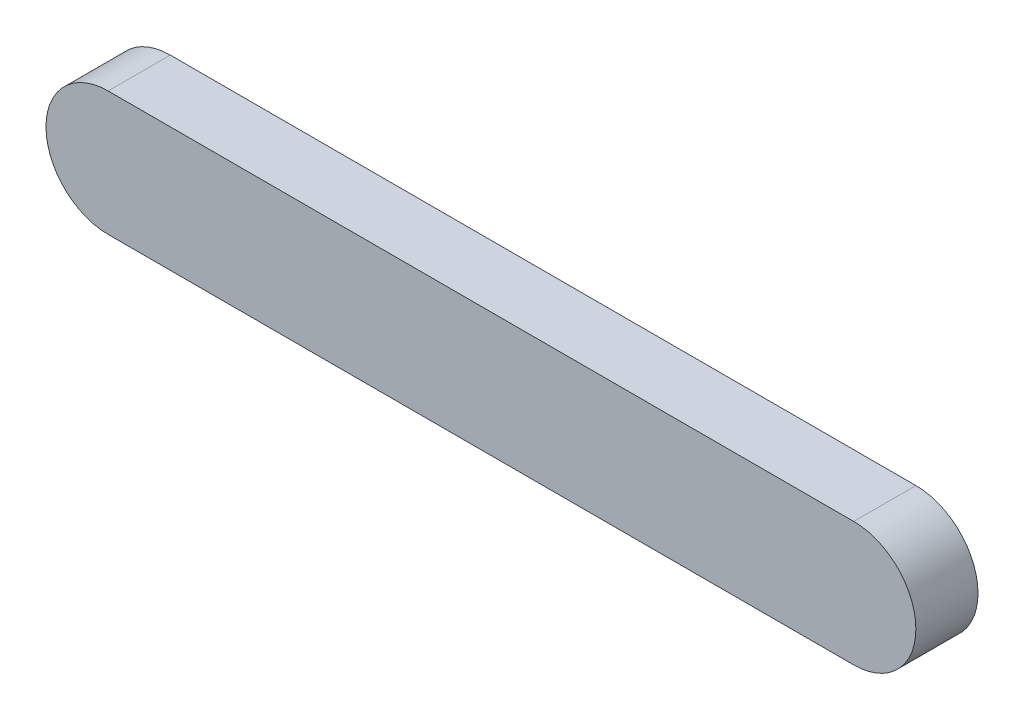
ISO-10303-21;
HEADER;
FILE_DESCRIPTION(('STEP AP214'),'2;1');
FILE_NAME('part.step','',(''),(''),'','','');
FILE_SCHEMA(('AUTOMOTIVE_DESIGN { 1 0 10303 214 1 1 1 1 }'));
ENDSEC;
DATA;
#1=APPLICATION_CONTEXT('core data for automotive mechanical design processes');
#2=APPLICATION_PROTOCOL_DEFINITION('international standard','automotive_design',2000,#1);
#3=PRODUCT_CONTEXT('',#1,'mechanical');
#4=PRODUCT('Part','Part','',(#3));
#5=PRODUCT_RELATED_PRODUCT_CATEGORY('part','',(#4));
#6=PRODUCT_DEFINITION_FORMATION('','',#4);
#7=PRODUCT_DEFINITION_CONTEXT('part definition',#1,'design');
#8=PRODUCT_DEFINITION('design','',#6,#7);
#9=PRODUCT_DEFINITION_SHAPE('','',#8);
#10=(LENGTH_UNIT() NAMED_UNIT(*) SI_UNIT(.MILLI.,.METRE.));
#11=(NAMED_UNIT(*) PLANE_ANGLE_UNIT() SI_UNIT($,.RADIAN.));
#12=(NAMED_UNIT(*) SI_UNIT($,.STERADIAN.) SOLID_ANGLE_UNIT());
#13=UNCERTAINTY_MEASURE_WITH_UNIT(LENGTH_MEASURE(1.E-05),#10,'distance_accuracy_value','');
#14=(GEOMETRIC_REPRESENTATION_CONTEXT(3) GLOBAL_UNCERTAINTY_ASSIGNED_CONTEXT((#13)) GLOBAL_UNIT_ASSIGNED_CONTEXT((#10,
#11,#12)) REPRESENTATION_CONTEXT('',''));
#15=CARTESIAN_POINT('',(0.,0.,0.));
#16=DIRECTION('',(0.,0.,1.));
#17=DIRECTION('',(1.,0.,0.));
#18=AXIS2_PLACEMENT_3D('',#15,#16,#17);
#19=CARTESIAN_POINT('',(0.,0.,10.));
#20=DIRECTION('',(0.,0.,-1.));
#21=DIRECTION('',(-1.,0.,0.));
#22=AXIS2_PLACEMENT_3D('',#19,#20,#21);
#23=CYLINDRICAL_SURFACE('',#22,10.);
#24=CARTESIAN_POINT('',(0.,0.,0.));
#25=DIRECTION('',(0.,0.,1.));
#26=DIRECTION('',(1.,0.,0.));
#27=AXIS2_PLACEMENT_3D('',#24,#25,#26);
#28=CIRCLE('',#27,10.);
#29=CARTESIAN_POINT('',(0.,10.,0.));
#30=VERTEX_POINT('',#29);
#31=CARTESIAN_POINT('',(0.,-10.,0.));
#32=VERTEX_POINT('',#31);
#33=EDGE_CURVE('E99',#30,#32,#28,.T.);
#34=ORIENTED_EDGE('',*,*,#33,.T.);
#35=DIRECTION('',(0.,0.,-1.));
#36=VECTOR('',#35,1.);
#37=CARTESIAN_POINT('',(0.,-10.,10.));
#38=LINE('',#37,#36);
#39=CARTESIAN_POINT('',(0.,-10.,10.));
#40=VERTEX_POINT('',#39);
#41=EDGE_CURVE('E11',#40,#32,#38,.T.);
#42=ORIENTED_EDGE('',*,*,#41,.F.);
#43=CARTESIAN_POINT('',(0.,0.,10.));
#44=DIRECTION('',(0.,0.,1.));
#45=DIRECTION('',(1.,0.,0.));
#46=AXIS2_PLACEMENT_3D('',#43,#44,#45);
#47=CIRCLE('',#46,10.);
#48=CARTESIAN_POINT('',(0.,10.,10.));
#49=VERTEX_POINT('',#48);
#50=EDGE_CURVE('E87',#49,#40,#47,.T.);
#51=ORIENTED_EDGE('',*,*,#50,.F.);
#52=DIRECTION('',(0.,0.,-1.));
#53=VECTOR('',#52,1.);
#54=CARTESIAN_POINT('',(0.,10.,10.));
#55=LINE('',#54,#53);
#56=EDGE_CURVE('E95',#49,#30,#55,.T.);
#57=ORIENTED_EDGE('',*,*,#56,.T.);
#58=EDGE_LOOP('',(#34,#42,#51,#57));
#59=FACE_BOUND('',#58,.T.);
#60=ADVANCED_FACE('F36',(#59),#23,.T.);
#61=CARTESIAN_POINT('',(0.,-10.,10.));
#62=DIRECTION('',(0.,1.,0.));
#63=DIRECTION('',(0.,0.,1.));
#64=AXIS2_PLACEMENT_3D('',#61,#62,#63);
#65=PLANE('',#64);
#66=DIRECTION('',(1.,0.,0.));
#67=VECTOR('',#66,1.);
#68=CARTESIAN_POINT('',(0.,-10.,0.));
#69=LINE('',#68,#67);
#70=CARTESIAN_POINT('',(120.,-10.,0.));
#71=VERTEX_POINT('',#70);
#72=EDGE_CURVE('E91',#32,#71,#69,.T.);
#73=ORIENTED_EDGE('',*,*,#72,.T.);
#74=DIRECTION('',(0.,0.,-1.));
#75=VECTOR('',#74,1.);
#76=CARTESIAN_POINT('',(120.,-10.,10.));
#77=LINE('',#76,#75);
#78=CARTESIAN_POINT('',(120.,-10.,10.));
#79=VERTEX_POINT('',#78);
#80=EDGE_CURVE('E44',#79,#71,#77,.T.);
#81=ORIENTED_EDGE('',*,*,#80,.F.);
#82=DIRECTION('',(1.,0.,0.));
#83=VECTOR('',#82,1.);
#84=CARTESIAN_POINT('',(0.,-10.,10.));
#85=LINE('',#84,#83);
#86=EDGE_CURVE('E82',#40,#79,#85,.T.);
#87=ORIENTED_EDGE('',*,*,#86,.F.);
#88=ORIENTED_EDGE('',*,*,#41,.T.);
#89=EDGE_LOOP('',(#73,#81,#87,#88));
#90=FACE_BOUND('',#89,.T.);
#91=ADVANCED_FACE('F90',(#90),#65,.F.);
#92=CARTESIAN_POINT('',(120.,0.,10.));
#93=DIRECTION('',(0.,0.,-1.));
#94=DIRECTION('',(-1.,0.,0.));
#95=AXIS2_PLACEMENT_3D('',#92,#93,#94);
#96=CYLINDRICAL_SURFACE('',#95,10.);
#97=CARTESIAN_POINT('',(120.,0.,0.));
#98=DIRECTION('',(0.,0.,1.));
#99=DIRECTION('',(1.,0.,0.));
#100=AXIS2_PLACEMENT_3D('',#97,#98,#99);
#101=CIRCLE('',#100,10.);
#102=CARTESIAN_POINT('',(120.,10.,0.));
#103=VERTEX_POINT('',#102);
#104=EDGE_CURVE('E69',#71,#103,#101,.T.);
#105=ORIENTED_EDGE('',*,*,#104,.T.);
#106=DIRECTION('',(0.,0.,-1.));
#107=VECTOR('',#106,1.);
#108=CARTESIAN_POINT('',(120.,10.,10.));
#109=LINE('',#108,#107);
#110=CARTESIAN_POINT('',(120.,10.,10.));
#111=VERTEX_POINT('',#110);
#112=EDGE_CURVE('E92',#111,#103,#109,.T.);
#113=ORIENTED_EDGE('',*,*,#112,.F.);
#114=CARTESIAN_POINT('',(120.,0.,10.));
#115=DIRECTION('',(0.,0.,1.));
#116=DIRECTION('',(1.,0.,0.));
#117=AXIS2_PLACEMENT_3D('',#114,#115,#116);
#118=CIRCLE('',#117,10.);
#119=EDGE_CURVE('E85',#79,#111,#118,.T.);
#120=ORIENTED_EDGE('',*,*,#119,.F.);
#121=ORIENTED_EDGE('',*,*,#80,.T.);
#122=EDGE_LOOP('',(#105,#113,#120,#121));
#123=FACE_BOUND('',#122,.T.);
#124=ADVANCED_FACE('F93',(#123),#96,.T.);
#125=CARTESIAN_POINT('',(0.,10.,10.));
#126=DIRECTION('',(0.,-1.,0.));
#127=DIRECTION('',(0.,0.,-1.));
#128=AXIS2_PLACEMENT_3D('',#125,#126,#127);
#129=PLANE('',#128);
#130=DIRECTION('',(-1.,0.,0.));
#131=VECTOR('',#130,1.);
#132=CARTESIAN_POINT('',(0.,10.,0.));
#133=LINE('',#132,#131);
#134=EDGE_CURVE('E75',#103,#30,#133,.T.);
#135=ORIENTED_EDGE('',*,*,#134,.T.);
#136=ORIENTED_EDGE('',*,*,#56,.F.);
#137=DIRECTION('',(-1.,0.,0.));
#138=VECTOR('',#137,1.);
#139=CARTESIAN_POINT('',(0.,10.,10.));
#140=LINE('',#139,#138);
#141=EDGE_CURVE('E52',#111,#49,#140,.T.);
#142=ORIENTED_EDGE('',*,*,#141,.F.);
#143=ORIENTED_EDGE('',*,*,#112,.T.);
#144=EDGE_LOOP('',(#135,#136,#142,#143));
#145=FACE_BOUND('',#144,.T.);
#146=ADVANCED_FACE('F106',(#145),#129,.F.);
#147=CARTESIAN_POINT('',(0.,0.,10.));
#148=DIRECTION('',(0.,0.,1.));
#149=DIRECTION('',(1.,0.,0.));
#150=AXIS2_PLACEMENT_3D('',#147,#148,#149);
#151=PLANE('',#150);
#152=ORIENTED_EDGE('',*,*,#50,.T.);
#153=ORIENTED_EDGE('',*,*,#86,.T.);
#154=ORIENTED_EDGE('',*,*,#119,.T.);
#155=ORIENTED_EDGE('',*,*,#141,.T.);
#156=EDGE_LOOP('',(#152,#153,#154,#155));
#157=FACE_BOUND('',#156,.T.);
#158=ADVANCED_FACE('F83',(#157),#151,.T.);
#159=CARTESIAN_POINT('',(0.,0.,0.));
#160=DIRECTION('',(0.,0.,1.));
#161=DIRECTION('',(1.,0.,0.));
#162=AXIS2_PLACEMENT_3D('',#159,#160,#161);
#163=PLANE('',#162);
#164=ORIENTED_EDGE('',*,*,#33,.F.);
#165=ORIENTED_EDGE('',*,*,#134,.F.);
#166=ORIENTED_EDGE('',*,*,#104,.F.);
#167=ORIENTED_EDGE('',*,*,#72,.F.);
#168=EDGE_LOOP('',(#164,#165,#166,#167));
#169=FACE_BOUND('',#168,.T.);
#170=ADVANCED_FACE('F109',(#169),#163,.F.);
#171=CLOSED_SHELL('',(#60,#91,#124,#146,#158,#170));
#172=MANIFOLD_SOLID_BREP('B2',#171);
#173=ADVANCED_BREP_SHAPE_REPRESENTATION('',(#18,#172),#14);
#174=SHAPE_DEFINITION_REPRESENTATION(#9,#173);
ENDSEC;
END-ISO-10303-21;
